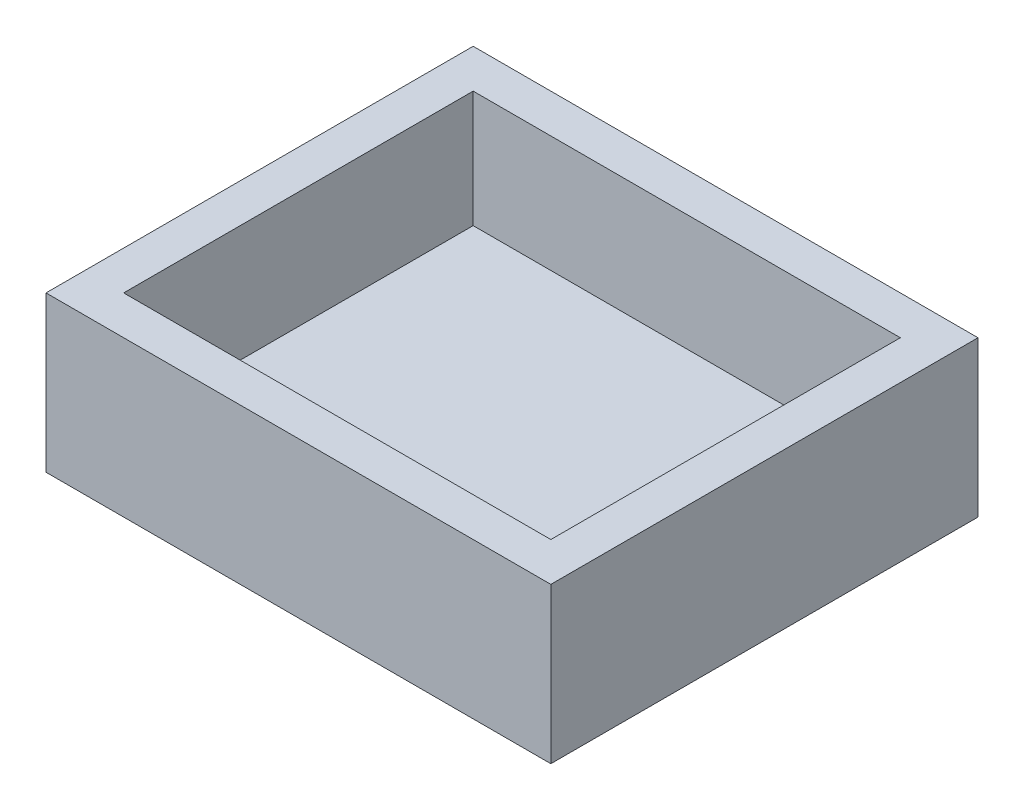
ISO-10303-21;
HEADER;
FILE_DESCRIPTION(('STEP AP214'),'2;1');
FILE_NAME('part.step','',(''),(''),'','','');
FILE_SCHEMA(('AUTOMOTIVE_DESIGN { 1 0 10303 214 1 1 1 1 }'));
ENDSEC;
DATA;
#1=APPLICATION_CONTEXT('core data for automotive mechanical design processes');
#2=APPLICATION_PROTOCOL_DEFINITION('international standard','automotive_design',2000,#1);
#3=PRODUCT_CONTEXT('',#1,'mechanical');
#4=PRODUCT('Part','Part','',(#3));
#5=PRODUCT_RELATED_PRODUCT_CATEGORY('part','',(#4));
#6=PRODUCT_DEFINITION_FORMATION('','',#4);
#7=PRODUCT_DEFINITION_CONTEXT('part definition',#1,'design');
#8=PRODUCT_DEFINITION('design','',#6,#7);
#9=PRODUCT_DEFINITION_SHAPE('','',#8);
#10=(LENGTH_UNIT() NAMED_UNIT(*) SI_UNIT(.MILLI.,.METRE.));
#11=(NAMED_UNIT(*) PLANE_ANGLE_UNIT() SI_UNIT($,.RADIAN.));
#12=(NAMED_UNIT(*) SI_UNIT($,.STERADIAN.) SOLID_ANGLE_UNIT());
#13=UNCERTAINTY_MEASURE_WITH_UNIT(LENGTH_MEASURE(1.E-05),#10,'distance_accuracy_value','');
#14=(GEOMETRIC_REPRESENTATION_CONTEXT(3) GLOBAL_UNCERTAINTY_ASSIGNED_CONTEXT((#13)) GLOBAL_UNIT_ASSIGNED_CONTEXT((#10,
#11,#12)) REPRESENTATION_CONTEXT('',''));
#15=CARTESIAN_POINT('',(0.,0.,0.));
#16=DIRECTION('',(0.,0.,1.));
#17=DIRECTION('',(1.,0.,0.));
#18=AXIS2_PLACEMENT_3D('',#15,#16,#17);
#19=CARTESIAN_POINT('',(0.,0.,11000.));
#20=DIRECTION('',(1.,0.,0.));
#21=DIRECTION('',(0.,1.,0.));
#22=AXIS2_PLACEMENT_3D('',#19,#20,#21);
#23=PLANE('',#22);
#24=DIRECTION('',(0.,-1.,0.));
#25=VECTOR('',#24,1.);
#26=CARTESIAN_POINT('',(0.,0.,0.));
#27=LINE('',#26,#25);
#28=CARTESIAN_POINT('',(-1.22124532708767E-12,4000.,0.));
#29=VERTEX_POINT('',#28);
#30=CARTESIAN_POINT('',(0.,0.,0.));
#31=VERTEX_POINT('',#30);
#32=EDGE_CURVE('E143',#29,#31,#27,.T.);
#33=ORIENTED_EDGE('',*,*,#32,.T.);
#34=DIRECTION('',(0.,0.,-1.));
#35=VECTOR('',#34,1.);
#36=CARTESIAN_POINT('',(0.,0.,11000.));
#37=LINE('',#36,#35);
#38=CARTESIAN_POINT('',(0.,0.,11000.));
#39=VERTEX_POINT('',#38);
#40=EDGE_CURVE('E12',#39,#31,#37,.T.);
#41=ORIENTED_EDGE('',*,*,#40,.F.);
#42=DIRECTION('',(0.,-1.,0.));
#43=VECTOR('',#42,1.);
#44=CARTESIAN_POINT('',(0.,0.,11000.));
#45=LINE('',#44,#43);
#46=CARTESIAN_POINT('',(-1.22124532708767E-12,4000.,11000.));
#47=VERTEX_POINT('',#46);
#48=EDGE_CURVE('E145',#47,#39,#45,.T.);
#49=ORIENTED_EDGE('',*,*,#48,.F.);
#50=DIRECTION('',(0.,0.,-1.));
#51=VECTOR('',#50,1.);
#52=CARTESIAN_POINT('',(-1.22124532708767E-12,4000.,11000.));
#53=LINE('',#52,#51);
#54=EDGE_CURVE('E151',#47,#29,#53,.T.);
#55=ORIENTED_EDGE('',*,*,#54,.T.);
#56=EDGE_LOOP('',(#33,#41,#49,#55));
#57=FACE_BOUND('',#56,.T.);
#58=ADVANCED_FACE('F37',(#57),#23,.F.);
#59=CARTESIAN_POINT('',(0.,0.,11000.));
#60=DIRECTION('',(0.,1.,0.));
#61=DIRECTION('',(0.,0.,1.));
#62=AXIS2_PLACEMENT_3D('',#59,#60,#61);
#63=PLANE('',#62);
#64=DIRECTION('',(1.,0.,0.));
#65=VECTOR('',#64,1.);
#66=CARTESIAN_POINT('',(0.,0.,0.));
#67=LINE('',#66,#65);
#68=CARTESIAN_POINT('',(13000.,0.,0.));
#69=VERTEX_POINT('',#68);
#70=EDGE_CURVE('E154',#31,#69,#67,.T.);
#71=ORIENTED_EDGE('',*,*,#70,.T.);
#72=DIRECTION('',(0.,0.,-1.));
#73=VECTOR('',#72,1.);
#74=CARTESIAN_POINT('',(13000.,0.,11000.));
#75=LINE('',#74,#73);
#76=CARTESIAN_POINT('',(13000.,0.,11000.));
#77=VERTEX_POINT('',#76);
#78=EDGE_CURVE('E44',#77,#69,#75,.T.);
#79=ORIENTED_EDGE('',*,*,#78,.F.);
#80=DIRECTION('',(1.,0.,0.));
#81=VECTOR('',#80,1.);
#82=CARTESIAN_POINT('',(0.,0.,11000.));
#83=LINE('',#82,#81);
#84=EDGE_CURVE('E88',#39,#77,#83,.T.);
#85=ORIENTED_EDGE('',*,*,#84,.F.);
#86=ORIENTED_EDGE('',*,*,#40,.T.);
#87=EDGE_LOOP('',(#71,#79,#85,#86));
#88=FACE_BOUND('',#87,.T.);
#89=ADVANCED_FACE('F181',(#88),#63,.F.);
#90=CARTESIAN_POINT('',(13000.,0.,11000.));
#91=DIRECTION('',(-1.,0.,0.));
#92=DIRECTION('',(0.,0.,1.));
#93=AXIS2_PLACEMENT_3D('',#90,#91,#92);
#94=PLANE('',#93);
#95=DIRECTION('',(0.,1.,0.));
#96=VECTOR('',#95,1.);
#97=CARTESIAN_POINT('',(13000.,0.,0.));
#98=LINE('',#97,#96);
#99=CARTESIAN_POINT('',(13000.,4000.,0.));
#100=VERTEX_POINT('',#99);
#101=EDGE_CURVE('E156',#69,#100,#98,.T.);
#102=ORIENTED_EDGE('',*,*,#101,.T.);
#103=DIRECTION('',(0.,0.,-1.));
#104=VECTOR('',#103,1.);
#105=CARTESIAN_POINT('',(13000.,4000.,11000.));
#106=LINE('',#105,#104);
#107=CARTESIAN_POINT('',(13000.,4000.,11000.));
#108=VERTEX_POINT('',#107);
#109=EDGE_CURVE('E160',#108,#100,#106,.T.);
#110=ORIENTED_EDGE('',*,*,#109,.F.);
#111=DIRECTION('',(0.,1.,0.));
#112=VECTOR('',#111,1.);
#113=CARTESIAN_POINT('',(13000.,0.,11000.));
#114=LINE('',#113,#112);
#115=EDGE_CURVE('E148',#77,#108,#114,.T.);
#116=ORIENTED_EDGE('',*,*,#115,.F.);
#117=ORIENTED_EDGE('',*,*,#78,.T.);
#118=EDGE_LOOP('',(#102,#110,#116,#117));
#119=FACE_BOUND('',#118,.T.);
#120=ADVANCED_FACE('F165',(#119),#94,.F.);
#121=CARTESIAN_POINT('',(-1.22124532708767E-12,4000.,11000.));
#122=DIRECTION('',(0.,-1.,0.));
#123=DIRECTION('',(0.,0.,-1.));
#124=AXIS2_PLACEMENT_3D('',#121,#122,#123);
#125=PLANE('',#124);
#126=DIRECTION('',(1.,0.,0.));
#127=VECTOR('',#126,1.);
#128=CARTESIAN_POINT('',(999.999999999998,4000.,10000.));
#129=LINE('',#128,#127);
#130=CARTESIAN_POINT('',(999.999999999998,4000.,10000.));
#131=VERTEX_POINT('',#130);
#132=CARTESIAN_POINT('',(12000.,4000.,10000.));
#133=VERTEX_POINT('',#132);
#134=EDGE_CURVE('E126',#131,#133,#129,.T.);
#135=ORIENTED_EDGE('',*,*,#134,.F.);
#136=DIRECTION('',(0.,0.,1.));
#137=VECTOR('',#136,1.);
#138=CARTESIAN_POINT('',(999.999999999998,4000.,10000.));
#139=LINE('',#138,#137);
#140=CARTESIAN_POINT('',(999.999999999998,4000.,1000.));
#141=VERTEX_POINT('',#140);
#142=EDGE_CURVE('E51',#141,#131,#139,.T.);
#143=ORIENTED_EDGE('',*,*,#142,.F.);
#144=DIRECTION('',(-1.,0.,0.));
#145=VECTOR('',#144,1.);
#146=CARTESIAN_POINT('',(999.999999999998,4000.,1000.));
#147=LINE('',#146,#145);
#148=CARTESIAN_POINT('',(12000.,4000.,1000.));
#149=VERTEX_POINT('',#148);
#150=EDGE_CURVE('E132',#149,#141,#147,.T.);
#151=ORIENTED_EDGE('',*,*,#150,.F.);
#152=DIRECTION('',(0.,0.,-1.));
#153=VECTOR('',#152,1.);
#154=CARTESIAN_POINT('',(12000.,4000.,10000.));
#155=LINE('',#154,#153);
#156=EDGE_CURVE('E116',#133,#149,#155,.T.);
#157=ORIENTED_EDGE('',*,*,#156,.F.);
#158=EDGE_LOOP('',(#135,#143,#151,#157));
#159=FACE_BOUND('',#158,.T.);
#160=DIRECTION('',(-1.,0.,0.));
#161=VECTOR('',#160,1.);
#162=CARTESIAN_POINT('',(-1.22124532708767E-12,4000.,0.));
#163=LINE('',#162,#161);
#164=EDGE_CURVE('E81',#100,#29,#163,.T.);
#165=ORIENTED_EDGE('',*,*,#164,.T.);
#166=ORIENTED_EDGE('',*,*,#54,.F.);
#167=DIRECTION('',(-1.,0.,0.));
#168=VECTOR('',#167,1.);
#169=CARTESIAN_POINT('',(-1.22124532708767E-12,4000.,11000.));
#170=LINE('',#169,#168);
#171=EDGE_CURVE('E60',#108,#47,#170,.T.);
#172=ORIENTED_EDGE('',*,*,#171,.F.);
#173=ORIENTED_EDGE('',*,*,#109,.T.);
#174=EDGE_LOOP('',(#165,#166,#172,#173));
#175=FACE_BOUND('',#174,.T.);
#176=ADVANCED_FACE('F130',(#159,#175),#125,.F.);
#177=CARTESIAN_POINT('',(0.,0.,11000.));
#178=DIRECTION('',(0.,0.,-1.));
#179=DIRECTION('',(-1.,0.,0.));
#180=AXIS2_PLACEMENT_3D('',#177,#178,#179);
#181=PLANE('',#180);
#182=ORIENTED_EDGE('',*,*,#48,.T.);
#183=ORIENTED_EDGE('',*,*,#84,.T.);
#184=ORIENTED_EDGE('',*,*,#115,.T.);
#185=ORIENTED_EDGE('',*,*,#171,.T.);
#186=EDGE_LOOP('',(#182,#183,#184,#185));
#187=FACE_BOUND('',#186,.T.);
#188=ADVANCED_FACE('F174',(#187),#181,.F.);
#189=CARTESIAN_POINT('',(0.,0.,0.));
#190=DIRECTION('',(0.,0.,-1.));
#191=DIRECTION('',(-1.,0.,0.));
#192=AXIS2_PLACEMENT_3D('',#189,#190,#191);
#193=PLANE('',#192);
#194=ORIENTED_EDGE('',*,*,#32,.F.);
#195=ORIENTED_EDGE('',*,*,#164,.F.);
#196=ORIENTED_EDGE('',*,*,#101,.F.);
#197=ORIENTED_EDGE('',*,*,#70,.F.);
#198=EDGE_LOOP('',(#194,#195,#196,#197));
#199=FACE_BOUND('',#198,.T.);
#200=ADVANCED_FACE('F169',(#199),#193,.T.);
#201=CARTESIAN_POINT('',(999.999999999998,-14212.6704035519,10000.));
#202=DIRECTION('',(-1.,0.,0.));
#203=DIRECTION('',(0.,0.,1.));
#204=AXIS2_PLACEMENT_3D('',#201,#202,#203);
#205=PLANE('',#204);
#206=DIRECTION('',(0.,0.,-1.));
#207=VECTOR('',#206,1.);
#208=CARTESIAN_POINT('',(999.999999999998,1000.,10000.));
#209=LINE('',#208,#207);
#210=CARTESIAN_POINT('',(999.999999999998,1000.,10000.));
#211=VERTEX_POINT('',#210);
#212=CARTESIAN_POINT('',(999.999999999998,1000.,1000.));
#213=VERTEX_POINT('',#212);
#214=EDGE_CURVE('E144',#211,#213,#209,.T.);
#215=ORIENTED_EDGE('',*,*,#214,.T.);
#216=DIRECTION('',(0.,1.,0.));
#217=VECTOR('',#216,1.);
#218=CARTESIAN_POINT('',(999.999999999998,-14212.6704035519,1000.));
#219=LINE('',#218,#217);
#220=EDGE_CURVE('E137',#213,#141,#219,.T.);
#221=ORIENTED_EDGE('',*,*,#220,.T.);
#222=ORIENTED_EDGE('',*,*,#142,.T.);
#223=DIRECTION('',(0.,1.,0.));
#224=VECTOR('',#223,1.);
#225=CARTESIAN_POINT('',(999.999999999998,-14212.6704035519,10000.));
#226=LINE('',#225,#224);
#227=EDGE_CURVE('E123',#211,#131,#226,.T.);
#228=ORIENTED_EDGE('',*,*,#227,.F.);
#229=EDGE_LOOP('',(#215,#221,#222,#228));
#230=FACE_BOUND('',#229,.T.);
#231=ADVANCED_FACE('F209',(#230),#205,.F.);
#232=CARTESIAN_POINT('',(999.999999999998,-14212.6704035519,1000.));
#233=DIRECTION('',(0.,0.,-1.));
#234=DIRECTION('',(-1.,0.,0.));
#235=AXIS2_PLACEMENT_3D('',#232,#233,#234);
#236=PLANE('',#235);
#237=DIRECTION('',(1.,0.,0.));
#238=VECTOR('',#237,1.);
#239=CARTESIAN_POINT('',(999.999999999998,1000.,1000.));
#240=LINE('',#239,#238);
#241=CARTESIAN_POINT('',(12000.,1000.,1000.));
#242=VERTEX_POINT('',#241);
#243=EDGE_CURVE('E262',#213,#242,#240,.T.);
#244=ORIENTED_EDGE('',*,*,#243,.T.);
#245=DIRECTION('',(0.,1.,0.));
#246=VECTOR('',#245,1.);
#247=CARTESIAN_POINT('',(12000.,-14212.6704035519,1000.));
#248=LINE('',#247,#246);
#249=EDGE_CURVE('E122',#242,#149,#248,.T.);
#250=ORIENTED_EDGE('',*,*,#249,.T.);
#251=ORIENTED_EDGE('',*,*,#150,.T.);
#252=ORIENTED_EDGE('',*,*,#220,.F.);
#253=EDGE_LOOP('',(#244,#250,#251,#252));
#254=FACE_BOUND('',#253,.T.);
#255=ADVANCED_FACE('F221',(#254),#236,.F.);
#256=CARTESIAN_POINT('',(12000.,-14212.6704035519,10000.));
#257=DIRECTION('',(1.,0.,0.));
#258=DIRECTION('',(0.,0.,-1.));
#259=AXIS2_PLACEMENT_3D('',#256,#257,#258);
#260=PLANE('',#259);
#261=DIRECTION('',(0.,0.,1.));
#262=VECTOR('',#261,1.);
#263=CARTESIAN_POINT('',(12000.,1000.,10000.));
#264=LINE('',#263,#262);
#265=CARTESIAN_POINT('',(12000.,1000.,10000.));
#266=VERTEX_POINT('',#265);
#267=EDGE_CURVE('E119',#242,#266,#264,.T.);
#268=ORIENTED_EDGE('',*,*,#267,.T.);
#269=DIRECTION('',(0.,1.,0.));
#270=VECTOR('',#269,1.);
#271=CARTESIAN_POINT('',(12000.,-14212.6704035519,10000.));
#272=LINE('',#271,#270);
#273=EDGE_CURVE('E111',#266,#133,#272,.T.);
#274=ORIENTED_EDGE('',*,*,#273,.T.);
#275=ORIENTED_EDGE('',*,*,#156,.T.);
#276=ORIENTED_EDGE('',*,*,#249,.F.);
#277=EDGE_LOOP('',(#268,#274,#275,#276));
#278=FACE_BOUND('',#277,.T.);
#279=ADVANCED_FACE('F113',(#278),#260,.F.);
#280=CARTESIAN_POINT('',(999.999999999998,-14212.6704035519,10000.));
#281=DIRECTION('',(0.,0.,1.));
#282=DIRECTION('',(1.,0.,0.));
#283=AXIS2_PLACEMENT_3D('',#280,#281,#282);
#284=PLANE('',#283);
#285=DIRECTION('',(-1.,0.,0.));
#286=VECTOR('',#285,1.);
#287=CARTESIAN_POINT('',(999.999999999998,1000.,10000.));
#288=LINE('',#287,#286);
#289=EDGE_CURVE('E141',#266,#211,#288,.T.);
#290=ORIENTED_EDGE('',*,*,#289,.T.);
#291=ORIENTED_EDGE('',*,*,#227,.T.);
#292=ORIENTED_EDGE('',*,*,#134,.T.);
#293=ORIENTED_EDGE('',*,*,#273,.F.);
#294=EDGE_LOOP('',(#290,#291,#292,#293));
#295=FACE_BOUND('',#294,.T.);
#296=ADVANCED_FACE('F127',(#295),#284,.F.);
#297=CARTESIAN_POINT('',(0.,1000.,11000.));
#298=DIRECTION('',(0.,1.,0.));
#299=DIRECTION('',(0.,0.,1.));
#300=AXIS2_PLACEMENT_3D('',#297,#298,#299);
#301=PLANE('',#300);
#302=ORIENTED_EDGE('',*,*,#214,.F.);
#303=ORIENTED_EDGE('',*,*,#289,.F.);
#304=ORIENTED_EDGE('',*,*,#267,.F.);
#305=ORIENTED_EDGE('',*,*,#243,.F.);
#306=EDGE_LOOP('',(#302,#303,#304,#305));
#307=FACE_BOUND('',#306,.T.);
#308=ADVANCED_FACE('F247',(#307),#301,.T.);
#309=CLOSED_SHELL('',(#58,#89,#120,#176,#188,#200,#231,#255,#279,#296,#308));
#310=MANIFOLD_SOLID_BREP('B2',#309);
#311=ADVANCED_BREP_SHAPE_REPRESENTATION('',(#18,#310),#14);
#312=SHAPE_DEFINITION_REPRESENTATION(#9,#311);
ENDSEC;
END-ISO-10303-21;
